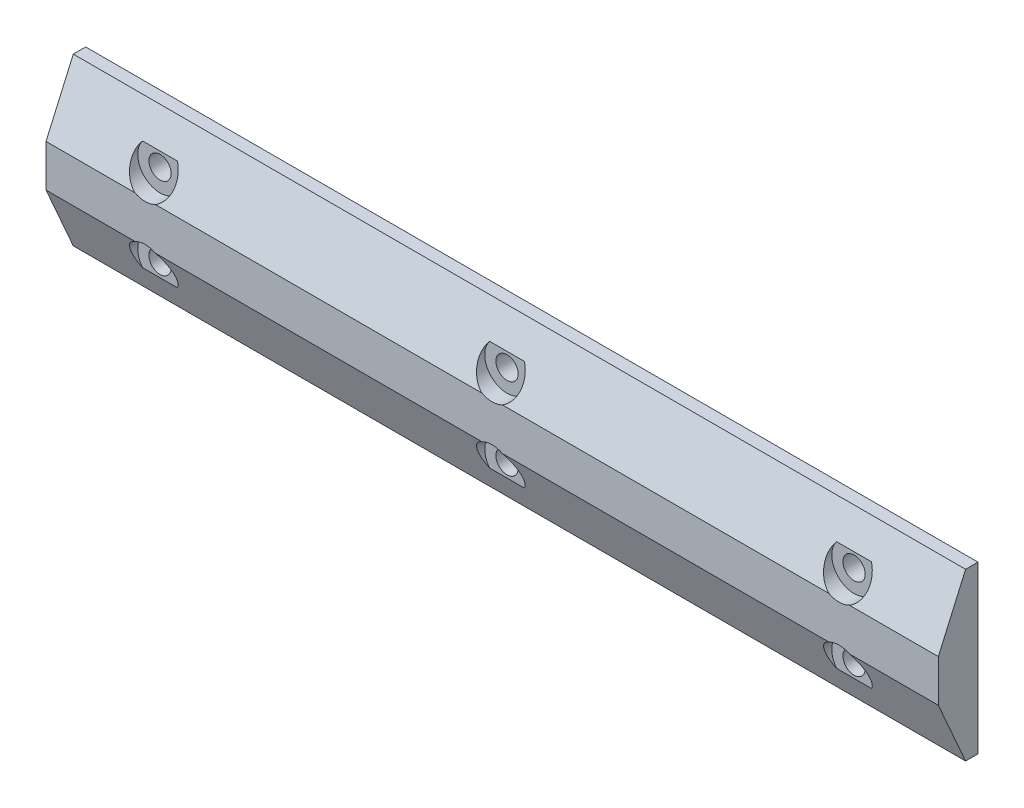
ISO-10303-21;
HEADER;
FILE_DESCRIPTION(('STEP AP214'),'2;1');
FILE_NAME('part.step','',(''),(''),'','','');
FILE_SCHEMA(('AUTOMOTIVE_DESIGN { 1 0 10303 214 1 1 1 1 }'));
ENDSEC;
DATA;
#1=APPLICATION_CONTEXT('core data for automotive mechanical design processes');
#2=APPLICATION_PROTOCOL_DEFINITION('international standard','automotive_design',2000,#1);
#3=PRODUCT_CONTEXT('',#1,'mechanical');
#4=PRODUCT('Part','Part','',(#3));
#5=PRODUCT_RELATED_PRODUCT_CATEGORY('part','',(#4));
#6=PRODUCT_DEFINITION_FORMATION('','',#4);
#7=PRODUCT_DEFINITION_CONTEXT('part definition',#1,'design');
#8=PRODUCT_DEFINITION('design','',#6,#7);
#9=PRODUCT_DEFINITION_SHAPE('','',#8);
#10=(LENGTH_UNIT() NAMED_UNIT(*) SI_UNIT(.MILLI.,.METRE.));
#11=(NAMED_UNIT(*) PLANE_ANGLE_UNIT() SI_UNIT($,.RADIAN.));
#12=(NAMED_UNIT(*) SI_UNIT($,.STERADIAN.) SOLID_ANGLE_UNIT());
#13=UNCERTAINTY_MEASURE_WITH_UNIT(LENGTH_MEASURE(1.E-05),#10,'distance_accuracy_value','');
#14=(GEOMETRIC_REPRESENTATION_CONTEXT(3) GLOBAL_UNCERTAINTY_ASSIGNED_CONTEXT((#13)) GLOBAL_UNIT_ASSIGNED_CONTEXT((#10,
#11,#12)) REPRESENTATION_CONTEXT('',''));
#15=CARTESIAN_POINT('',(0.,0.,0.));
#16=DIRECTION('',(0.,0.,1.));
#17=DIRECTION('',(1.,0.,0.));
#18=AXIS2_PLACEMENT_3D('',#15,#16,#17);
#19=CARTESIAN_POINT('',(0.,0.,16.));
#20=DIRECTION('',(1.,0.,0.));
#21=DIRECTION('',(0.,0.,-1.));
#22=AXIS2_PLACEMENT_3D('',#19,#20,#21);
#23=PLANE('',#22);
#24=DIRECTION('',(0.,0.,-1.));
#25=VECTOR('',#24,1.);
#26=CARTESIAN_POINT('',(0.,0.,16.));
#27=LINE('',#26,#25);
#28=CARTESIAN_POINT('',(0.,0.,5.));
#29=VERTEX_POINT('',#28);
#30=CARTESIAN_POINT('',(0.,0.,0.));
#31=VERTEX_POINT('',#30);
#32=EDGE_CURVE('E327',#29,#31,#27,.T.);
#33=ORIENTED_EDGE('',*,*,#32,.F.);
#34=DIRECTION('',(0.,-0.915315032422765,-0.402738614266017));
#35=VECTOR('',#34,1.);
#36=CARTESIAN_POINT('',(0.,0.,5.));
#37=LINE('',#36,#35);
#38=CARTESIAN_POINT('',(0.,25.,16.));
#39=VERTEX_POINT('',#38);
#40=EDGE_CURVE('E186',#39,#29,#37,.T.);
#41=ORIENTED_EDGE('',*,*,#40,.F.);
#42=DIRECTION('',(0.,-1.,0.));
#43=VECTOR('',#42,1.);
#44=CARTESIAN_POINT('',(0.,0.,16.));
#45=LINE('',#44,#43);
#46=CARTESIAN_POINT('',(0.,42.,16.));
#47=VERTEX_POINT('',#46);
#48=EDGE_CURVE('E309',#47,#39,#45,.T.);
#49=ORIENTED_EDGE('',*,*,#48,.F.);
#50=DIRECTION('',(0.,-0.915315032422765,0.402738614266017));
#51=VECTOR('',#50,1.);
#52=CARTESIAN_POINT('',(0.,67.,5.));
#53=LINE('',#52,#51);
#54=CARTESIAN_POINT('',(0.,67.,5.));
#55=VERTEX_POINT('',#54);
#56=EDGE_CURVE('E172',#55,#47,#53,.T.);
#57=ORIENTED_EDGE('',*,*,#56,.F.);
#58=DIRECTION('',(0.,0.,-1.));
#59=VECTOR('',#58,1.);
#60=CARTESIAN_POINT('',(0.,67.,16.));
#61=LINE('',#60,#59);
#62=CARTESIAN_POINT('',(0.,67.,0.));
#63=VERTEX_POINT('',#62);
#64=EDGE_CURVE('E308',#55,#63,#61,.T.);
#65=ORIENTED_EDGE('',*,*,#64,.T.);
#66=DIRECTION('',(0.,-1.,0.));
#67=VECTOR('',#66,1.);
#68=CARTESIAN_POINT('',(0.,0.,0.));
#69=LINE('',#68,#67);
#70=EDGE_CURVE('E292',#63,#31,#69,.T.);
#71=ORIENTED_EDGE('',*,*,#70,.T.);
#72=EDGE_LOOP('',(#33,#41,#49,#57,#65,#71));
#73=FACE_BOUND('',#72,.T.);
#74=ADVANCED_FACE('F34',(#73),#23,.F.);
#75=CARTESIAN_POINT('',(0.,0.,16.));
#76=DIRECTION('',(0.,1.,0.));
#77=DIRECTION('',(0.,0.,1.));
#78=AXIS2_PLACEMENT_3D('',#75,#76,#77);
#79=PLANE('',#78);
#80=DIRECTION('',(0.,0.,-1.));
#81=VECTOR('',#80,1.);
#82=CARTESIAN_POINT('',(360.,0.,16.));
#83=LINE('',#82,#81);
#84=CARTESIAN_POINT('',(360.,0.,5.));
#85=VERTEX_POINT('',#84);
#86=CARTESIAN_POINT('',(360.,0.,0.));
#87=VERTEX_POINT('',#86);
#88=EDGE_CURVE('E325',#85,#87,#83,.T.);
#89=ORIENTED_EDGE('',*,*,#88,.F.);
#90=DIRECTION('',(-1.,0.,0.));
#91=VECTOR('',#90,1.);
#92=CARTESIAN_POINT('',(360.,0.,5.));
#93=LINE('',#92,#91);
#94=EDGE_CURVE('E289',#85,#29,#93,.T.);
#95=ORIENTED_EDGE('',*,*,#94,.T.);
#96=ORIENTED_EDGE('',*,*,#32,.T.);
#97=DIRECTION('',(1.,0.,0.));
#98=VECTOR('',#97,1.);
#99=CARTESIAN_POINT('',(0.,0.,0.));
#100=LINE('',#99,#98);
#101=EDGE_CURVE('E317',#31,#87,#100,.T.);
#102=ORIENTED_EDGE('',*,*,#101,.T.);
#103=EDGE_LOOP('',(#89,#95,#96,#102));
#104=FACE_BOUND('',#103,.T.);
#105=ADVANCED_FACE('F358',(#104),#79,.F.);
#106=CARTESIAN_POINT('',(360.,0.,16.));
#107=DIRECTION('',(-1.,0.,0.));
#108=DIRECTION('',(0.,0.,1.));
#109=AXIS2_PLACEMENT_3D('',#106,#107,#108);
#110=PLANE('',#109);
#111=DIRECTION('',(0.,1.,0.));
#112=VECTOR('',#111,1.);
#113=CARTESIAN_POINT('',(360.,0.,16.));
#114=LINE('',#113,#112);
#115=CARTESIAN_POINT('',(360.,25.,16.));
#116=VERTEX_POINT('',#115);
#117=CARTESIAN_POINT('',(360.,42.,16.));
#118=VERTEX_POINT('',#117);
#119=EDGE_CURVE('E302',#116,#118,#114,.T.);
#120=ORIENTED_EDGE('',*,*,#119,.F.);
#121=DIRECTION('',(0.,-0.915315032422765,-0.402738614266017));
#122=VECTOR('',#121,1.);
#123=CARTESIAN_POINT('',(360.,0.,5.));
#124=LINE('',#123,#122);
#125=EDGE_CURVE('E189',#116,#85,#124,.T.);
#126=ORIENTED_EDGE('',*,*,#125,.T.);
#127=ORIENTED_EDGE('',*,*,#88,.T.);
#128=DIRECTION('',(0.,1.,0.));
#129=VECTOR('',#128,1.);
#130=CARTESIAN_POINT('',(360.,0.,0.));
#131=LINE('',#130,#129);
#132=CARTESIAN_POINT('',(360.,67.,0.));
#133=VERTEX_POINT('',#132);
#134=EDGE_CURVE('E320',#87,#133,#131,.T.);
#135=ORIENTED_EDGE('',*,*,#134,.T.);
#136=DIRECTION('',(0.,0.,-1.));
#137=VECTOR('',#136,1.);
#138=CARTESIAN_POINT('',(360.,67.,16.));
#139=LINE('',#138,#137);
#140=CARTESIAN_POINT('',(360.,67.,5.));
#141=VERTEX_POINT('',#140);
#142=EDGE_CURVE('E304',#141,#133,#139,.T.);
#143=ORIENTED_EDGE('',*,*,#142,.F.);
#144=DIRECTION('',(0.,-0.915315032422765,0.402738614266017));
#145=VECTOR('',#144,1.);
#146=CARTESIAN_POINT('',(360.,67.,5.));
#147=LINE('',#146,#145);
#148=EDGE_CURVE('E182',#141,#118,#147,.T.);
#149=ORIENTED_EDGE('',*,*,#148,.T.);
#150=EDGE_LOOP('',(#120,#126,#127,#135,#143,#149));
#151=FACE_BOUND('',#150,.T.);
#152=ADVANCED_FACE('F301',(#151),#110,.F.);
#153=CARTESIAN_POINT('',(0.,67.,16.));
#154=DIRECTION('',(0.,-1.,0.));
#155=DIRECTION('',(0.,0.,-1.));
#156=AXIS2_PLACEMENT_3D('',#153,#154,#155);
#157=PLANE('',#156);
#158=ORIENTED_EDGE('',*,*,#64,.F.);
#159=DIRECTION('',(-1.,0.,0.));
#160=VECTOR('',#159,1.);
#161=CARTESIAN_POINT('',(360.,67.,5.));
#162=LINE('',#161,#160);
#163=EDGE_CURVE('E177',#141,#55,#162,.T.);
#164=ORIENTED_EDGE('',*,*,#163,.F.);
#165=ORIENTED_EDGE('',*,*,#142,.T.);
#166=DIRECTION('',(-1.,0.,0.));
#167=VECTOR('',#166,1.);
#168=CARTESIAN_POINT('',(0.,67.,0.));
#169=LINE('',#168,#167);
#170=EDGE_CURVE('E312',#133,#63,#169,.T.);
#171=ORIENTED_EDGE('',*,*,#170,.T.);
#172=EDGE_LOOP('',(#158,#164,#165,#171));
#173=FACE_BOUND('',#172,.T.);
#174=ADVANCED_FACE('F388',(#173),#157,.F.);
#175=CARTESIAN_POINT('',(0.,0.,16.));
#176=DIRECTION('',(0.,0.,-1.));
#177=DIRECTION('',(-1.,0.,0.));
#178=AXIS2_PLACEMENT_3D('',#175,#176,#177);
#179=PLANE('',#178);
#180=DIRECTION('',(-1.,0.,0.));
#181=VECTOR('',#180,1.);
#182=CARTESIAN_POINT('',(360.,42.,16.));
#183=LINE('',#182,#181);
#184=CARTESIAN_POINT('',(175.876894374382,42.,16.));
#185=VERTEX_POINT('',#184);
#186=CARTESIAN_POINT('',(44.1231056256177,42.,16.));
#187=VERTEX_POINT('',#186);
#188=EDGE_CURVE('E176',#185,#187,#183,.T.);
#189=ORIENTED_EDGE('',*,*,#188,.T.);
#190=CARTESIAN_POINT('',(40.,50.,16.));
#191=DIRECTION('',(0.,0.,1.));
#192=DIRECTION('',(1.,0.,0.));
#193=AXIS2_PLACEMENT_3D('',#190,#191,#192);
#194=CIRCLE('',#193,9.);
#195=CARTESIAN_POINT('',(35.8768943743823,42.,16.));
#196=VERTEX_POINT('',#195);
#197=EDGE_CURVE('E165',#196,#187,#194,.T.);
#198=ORIENTED_EDGE('',*,*,#197,.F.);
#199=EDGE_CURVE('E170',#196,#47,#183,.T.);
#200=ORIENTED_EDGE('',*,*,#199,.T.);
#201=ORIENTED_EDGE('',*,*,#48,.T.);
#202=DIRECTION('',(-1.,0.,0.));
#203=VECTOR('',#202,1.);
#204=CARTESIAN_POINT('',(360.,25.,16.));
#205=LINE('',#204,#203);
#206=CARTESIAN_POINT('',(35.8768943743823,25.,16.));
#207=VERTEX_POINT('',#206);
#208=EDGE_CURVE('E233',#207,#39,#205,.T.);
#209=ORIENTED_EDGE('',*,*,#208,.F.);
#210=CARTESIAN_POINT('',(40.,17.,16.));
#211=DIRECTION('',(0.,0.,1.));
#212=DIRECTION('',(1.,0.,0.));
#213=AXIS2_PLACEMENT_3D('',#210,#211,#212);
#214=CIRCLE('',#213,9.);
#215=CARTESIAN_POINT('',(44.1231056256177,25.,16.));
#216=VERTEX_POINT('',#215);
#217=EDGE_CURVE('E231',#216,#207,#214,.T.);
#218=ORIENTED_EDGE('',*,*,#217,.F.);
#219=CARTESIAN_POINT('',(175.876894374382,25.,16.));
#220=VERTEX_POINT('',#219);
#221=EDGE_CURVE('E227',#220,#216,#205,.T.);
#222=ORIENTED_EDGE('',*,*,#221,.F.);
#223=CARTESIAN_POINT('',(180.,17.,16.));
#224=DIRECTION('',(0.,0.,1.));
#225=DIRECTION('',(1.,0.,0.));
#226=AXIS2_PLACEMENT_3D('',#223,#224,#225);
#227=CIRCLE('',#226,9.00000000000001);
#228=CARTESIAN_POINT('',(184.123105625618,25.,16.));
#229=VERTEX_POINT('',#228);
#230=EDGE_CURVE('E256',#229,#220,#227,.T.);
#231=ORIENTED_EDGE('',*,*,#230,.F.);
#232=CARTESIAN_POINT('',(315.876894374382,25.,16.));
#233=VERTEX_POINT('',#232);
#234=EDGE_CURVE('E296',#233,#229,#205,.T.);
#235=ORIENTED_EDGE('',*,*,#234,.F.);
#236=CARTESIAN_POINT('',(320.,17.,16.));
#237=DIRECTION('',(0.,0.,1.));
#238=DIRECTION('',(1.,0.,0.));
#239=AXIS2_PLACEMENT_3D('',#236,#237,#238);
#240=CIRCLE('',#239,9.00000000000001);
#241=CARTESIAN_POINT('',(324.123105625618,25.,16.));
#242=VERTEX_POINT('',#241);
#243=EDGE_CURVE('E276',#242,#233,#240,.T.);
#244=ORIENTED_EDGE('',*,*,#243,.F.);
#245=EDGE_CURVE('E293',#116,#242,#205,.T.);
#246=ORIENTED_EDGE('',*,*,#245,.F.);
#247=ORIENTED_EDGE('',*,*,#119,.T.);
#248=CARTESIAN_POINT('',(324.123105625618,42.,16.));
#249=VERTEX_POINT('',#248);
#250=EDGE_CURVE('E179',#118,#249,#183,.T.);
#251=ORIENTED_EDGE('',*,*,#250,.T.);
#252=CARTESIAN_POINT('',(320.,50.,16.));
#253=DIRECTION('',(0.,0.,1.));
#254=DIRECTION('',(1.,0.,0.));
#255=AXIS2_PLACEMENT_3D('',#252,#253,#254);
#256=CIRCLE('',#255,9.00000000000001);
#257=CARTESIAN_POINT('',(315.876894374382,42.,16.));
#258=VERTEX_POINT('',#257);
#259=EDGE_CURVE('E197',#258,#249,#256,.T.);
#260=ORIENTED_EDGE('',*,*,#259,.F.);
#261=CARTESIAN_POINT('',(184.123105625618,42.,16.));
#262=VERTEX_POINT('',#261);
#263=EDGE_CURVE('E181',#258,#262,#183,.T.);
#264=ORIENTED_EDGE('',*,*,#263,.T.);
#265=CARTESIAN_POINT('',(180.,50.,16.));
#266=DIRECTION('',(0.,0.,1.));
#267=DIRECTION('',(1.,0.,0.));
#268=AXIS2_PLACEMENT_3D('',#265,#266,#267);
#269=CIRCLE('',#268,9.00000000000001);
#270=EDGE_CURVE('E195',#185,#262,#269,.T.);
#271=ORIENTED_EDGE('',*,*,#270,.F.);
#272=EDGE_LOOP('',(#189,#198,#200,#201,#209,#218,#222,#231,#235,#244,#246,#247,#251,#260,#264,#271));
#273=FACE_BOUND('',#272,.T.);
#274=ADVANCED_FACE('F194',(#273),#179,.F.);
#275=CARTESIAN_POINT('',(0.,0.,0.));
#276=DIRECTION('',(0.,0.,-1.));
#277=DIRECTION('',(-1.,0.,0.));
#278=AXIS2_PLACEMENT_3D('',#275,#276,#277);
#279=PLANE('',#278);
#280=CARTESIAN_POINT('',(40.,50.,0.));
#281=DIRECTION('',(0.,0.,1.));
#282=DIRECTION('',(1.,0.,0.));
#283=AXIS2_PLACEMENT_3D('',#280,#281,#282);
#284=CIRCLE('',#283,4.5);
#285=CARTESIAN_POINT('',(44.5,50.,0.));
#286=VERTEX_POINT('',#285);
#287=EDGE_CURVE('E234',#286,#286,#284,.T.);
#288=ORIENTED_EDGE('',*,*,#287,.T.);
#289=EDGE_LOOP('',(#288));
#290=FACE_BOUND('',#289,.T.);
#291=CARTESIAN_POINT('',(40.,17.,0.));
#292=DIRECTION('',(0.,0.,1.));
#293=DIRECTION('',(1.,0.,0.));
#294=AXIS2_PLACEMENT_3D('',#291,#292,#293);
#295=CIRCLE('',#294,4.5);
#296=CARTESIAN_POINT('',(44.5,17.,0.));
#297=VERTEX_POINT('',#296);
#298=EDGE_CURVE('E244',#297,#297,#295,.T.);
#299=ORIENTED_EDGE('',*,*,#298,.T.);
#300=EDGE_LOOP('',(#299));
#301=FACE_BOUND('',#300,.T.);
#302=CARTESIAN_POINT('',(180.,50.,0.));
#303=DIRECTION('',(0.,0.,1.));
#304=DIRECTION('',(1.,0.,0.));
#305=AXIS2_PLACEMENT_3D('',#302,#303,#304);
#306=CIRCLE('',#305,4.5);
#307=CARTESIAN_POINT('',(184.5,50.,0.));
#308=VERTEX_POINT('',#307);
#309=EDGE_CURVE('E253',#308,#308,#306,.T.);
#310=ORIENTED_EDGE('',*,*,#309,.T.);
#311=EDGE_LOOP('',(#310));
#312=FACE_BOUND('',#311,.T.);
#313=CARTESIAN_POINT('',(180.,17.,0.));
#314=DIRECTION('',(0.,0.,1.));
#315=DIRECTION('',(1.,0.,0.));
#316=AXIS2_PLACEMENT_3D('',#313,#314,#315);
#317=CIRCLE('',#316,4.5);
#318=CARTESIAN_POINT('',(184.5,17.,0.));
#319=VERTEX_POINT('',#318);
#320=EDGE_CURVE('E263',#319,#319,#317,.T.);
#321=ORIENTED_EDGE('',*,*,#320,.T.);
#322=EDGE_LOOP('',(#321));
#323=FACE_BOUND('',#322,.T.);
#324=CARTESIAN_POINT('',(320.,50.,0.));
#325=DIRECTION('',(0.,0.,1.));
#326=DIRECTION('',(1.,0.,0.));
#327=AXIS2_PLACEMENT_3D('',#324,#325,#326);
#328=CIRCLE('',#327,4.5);
#329=CARTESIAN_POINT('',(324.5,50.,0.));
#330=VERTEX_POINT('',#329);
#331=EDGE_CURVE('E273',#330,#330,#328,.T.);
#332=ORIENTED_EDGE('',*,*,#331,.T.);
#333=EDGE_LOOP('',(#332));
#334=FACE_BOUND('',#333,.T.);
#335=CARTESIAN_POINT('',(320.,17.,0.));
#336=DIRECTION('',(0.,0.,1.));
#337=DIRECTION('',(1.,0.,0.));
#338=AXIS2_PLACEMENT_3D('',#335,#336,#337);
#339=CIRCLE('',#338,4.5);
#340=CARTESIAN_POINT('',(324.5,17.,0.));
#341=VERTEX_POINT('',#340);
#342=EDGE_CURVE('E284',#341,#341,#339,.T.);
#343=ORIENTED_EDGE('',*,*,#342,.T.);
#344=EDGE_LOOP('',(#343));
#345=FACE_BOUND('',#344,.T.);
#346=ORIENTED_EDGE('',*,*,#70,.F.);
#347=ORIENTED_EDGE('',*,*,#170,.F.);
#348=ORIENTED_EDGE('',*,*,#134,.F.);
#349=ORIENTED_EDGE('',*,*,#101,.F.);
#350=EDGE_LOOP('',(#346,#347,#348,#349));
#351=FACE_BOUND('',#350,.T.);
#352=ADVANCED_FACE('F361',(#290,#301,#312,#323,#334,#345,#351),#279,.T.);
#353=CARTESIAN_POINT('',(360.,67.,5.));
#354=DIRECTION('',(0.,-0.402738614266017,-0.915315032422766));
#355=DIRECTION('',(0.,0.915315032422766,-0.402738614266017));
#356=AXIS2_PLACEMENT_3D('',#353,#354,#355);
#357=PLANE('',#356);
#358=ORIENTED_EDGE('',*,*,#199,.F.);
#359=CARTESIAN_POINT('',(40.,50.,12.48));
#360=DIRECTION('',(0.,-0.402738614266017,-0.915315032422766));
#361=DIRECTION('',(0.,-0.915315032422766,0.402738614266017));
#362=AXIS2_PLACEMENT_3D('',#359,#360,#361);
#363=ELLIPSE('',#362,9.83268020429832,9.);
#364=CARTESIAN_POINT('',(32.9834905431064,55.6363636363636,10.));
#365=VERTEX_POINT('',#364);
#366=EDGE_CURVE('E11',#196,#365,#363,.T.);
#367=ORIENTED_EDGE('',*,*,#366,.T.);
#368=DIRECTION('',(1.,0.,0.));
#369=VECTOR('',#368,1.);
#370=CARTESIAN_POINT('',(360.,55.6363636363636,10.));
#371=LINE('',#370,#369);
#372=CARTESIAN_POINT('',(47.0165094568936,55.6363636363636,10.));
#373=VERTEX_POINT('',#372);
#374=EDGE_CURVE('E156',#365,#373,#371,.T.);
#375=ORIENTED_EDGE('',*,*,#374,.T.);
#376=EDGE_CURVE('E37',#373,#187,#363,.T.);
#377=ORIENTED_EDGE('',*,*,#376,.T.);
#378=ORIENTED_EDGE('',*,*,#188,.F.);
#379=CARTESIAN_POINT('',(180.,50.,12.48));
#380=DIRECTION('',(0.,-0.402738614266017,-0.915315032422766));
#381=DIRECTION('',(0.,-0.915315032422766,0.402738614266017));
#382=AXIS2_PLACEMENT_3D('',#379,#380,#381);
#383=ELLIPSE('',#382,9.83268020429833,9.00000000000001);
#384=CARTESIAN_POINT('',(172.983490543106,55.6363636363636,10.));
#385=VERTEX_POINT('',#384);
#386=EDGE_CURVE('E209',#185,#385,#383,.T.);
#387=ORIENTED_EDGE('',*,*,#386,.T.);
#388=DIRECTION('',(1.,0.,0.));
#389=VECTOR('',#388,1.);
#390=CARTESIAN_POINT('',(360.,55.6363636363636,10.));
#391=LINE('',#390,#389);
#392=CARTESIAN_POINT('',(187.016509456894,55.6363636363636,10.));
#393=VERTEX_POINT('',#392);
#394=EDGE_CURVE('E206',#385,#393,#391,.T.);
#395=ORIENTED_EDGE('',*,*,#394,.T.);
#396=EDGE_CURVE('E204',#393,#262,#383,.T.);
#397=ORIENTED_EDGE('',*,*,#396,.T.);
#398=ORIENTED_EDGE('',*,*,#263,.F.);
#399=CARTESIAN_POINT('',(320.,50.,12.48));
#400=DIRECTION('',(0.,-0.402738614266017,-0.915315032422766));
#401=DIRECTION('',(0.,-0.915315032422766,0.402738614266017));
#402=AXIS2_PLACEMENT_3D('',#399,#400,#401);
#403=ELLIPSE('',#402,9.83268020429833,9.00000000000001);
#404=CARTESIAN_POINT('',(312.983490543106,55.6363636363636,10.));
#405=VERTEX_POINT('',#404);
#406=EDGE_CURVE('E201',#258,#405,#403,.T.);
#407=ORIENTED_EDGE('',*,*,#406,.T.);
#408=DIRECTION('',(1.,0.,0.));
#409=VECTOR('',#408,1.);
#410=CARTESIAN_POINT('',(360.,55.6363636363636,10.));
#411=LINE('',#410,#409);
#412=CARTESIAN_POINT('',(327.016509456894,55.6363636363636,10.));
#413=VERTEX_POINT('',#412);
#414=EDGE_CURVE('E339',#405,#413,#411,.T.);
#415=ORIENTED_EDGE('',*,*,#414,.T.);
#416=EDGE_CURVE('E336',#413,#249,#403,.T.);
#417=ORIENTED_EDGE('',*,*,#416,.T.);
#418=ORIENTED_EDGE('',*,*,#250,.F.);
#419=ORIENTED_EDGE('',*,*,#148,.F.);
#420=ORIENTED_EDGE('',*,*,#163,.T.);
#421=ORIENTED_EDGE('',*,*,#56,.T.);
#422=EDGE_LOOP('',(#358,#367,#375,#377,#378,#387,#395,#397,#398,#407,#415,#417,#418,#419,#420,#421));
#423=FACE_BOUND('',#422,.T.);
#424=ADVANCED_FACE('F168',(#423),#357,.F.);
#425=CARTESIAN_POINT('',(360.,0.,5.));
#426=DIRECTION('',(0.,0.402738614266017,-0.915315032422766));
#427=DIRECTION('',(0.,0.915315032422766,0.402738614266017));
#428=AXIS2_PLACEMENT_3D('',#425,#426,#427);
#429=PLANE('',#428);
#430=ORIENTED_EDGE('',*,*,#221,.T.);
#431=CARTESIAN_POINT('',(40.,17.,12.48));
#432=DIRECTION('',(0.,0.402738614266017,-0.915315032422766));
#433=DIRECTION('',(0.,0.915315032422766,0.402738614266017));
#434=AXIS2_PLACEMENT_3D('',#431,#432,#433);
#435=ELLIPSE('',#434,9.83268020429832,9.);
#436=CARTESIAN_POINT('',(47.0165094568936,11.3636363636364,10.));
#437=VERTEX_POINT('',#436);
#438=EDGE_CURVE('E160',#216,#437,#435,.T.);
#439=ORIENTED_EDGE('',*,*,#438,.T.);
#440=DIRECTION('',(-1.,0.,0.));
#441=VECTOR('',#440,1.);
#442=CARTESIAN_POINT('',(360.,11.3636363636364,10.));
#443=LINE('',#442,#441);
#444=CARTESIAN_POINT('',(32.9834905431064,11.3636363636364,10.));
#445=VERTEX_POINT('',#444);
#446=EDGE_CURVE('E211',#437,#445,#443,.T.);
#447=ORIENTED_EDGE('',*,*,#446,.T.);
#448=EDGE_CURVE('E218',#445,#207,#435,.T.);
#449=ORIENTED_EDGE('',*,*,#448,.T.);
#450=ORIENTED_EDGE('',*,*,#208,.T.);
#451=ORIENTED_EDGE('',*,*,#40,.T.);
#452=ORIENTED_EDGE('',*,*,#94,.F.);
#453=ORIENTED_EDGE('',*,*,#125,.F.);
#454=ORIENTED_EDGE('',*,*,#245,.T.);
#455=CARTESIAN_POINT('',(320.,17.,12.48));
#456=DIRECTION('',(0.,0.402738614266017,-0.915315032422766));
#457=DIRECTION('',(0.,0.915315032422766,0.402738614266017));
#458=AXIS2_PLACEMENT_3D('',#455,#456,#457);
#459=ELLIPSE('',#458,9.83268020429833,9.00000000000001);
#460=CARTESIAN_POINT('',(327.016509456894,11.3636363636364,10.));
#461=VERTEX_POINT('',#460);
#462=EDGE_CURVE('E333',#242,#461,#459,.T.);
#463=ORIENTED_EDGE('',*,*,#462,.T.);
#464=DIRECTION('',(-1.,0.,0.));
#465=VECTOR('',#464,1.);
#466=CARTESIAN_POINT('',(360.,11.3636363636364,10.));
#467=LINE('',#466,#465);
#468=CARTESIAN_POINT('',(312.983490543106,11.3636363636364,10.));
#469=VERTEX_POINT('',#468);
#470=EDGE_CURVE('E332',#461,#469,#467,.T.);
#471=ORIENTED_EDGE('',*,*,#470,.T.);
#472=EDGE_CURVE('E329',#469,#233,#459,.T.);
#473=ORIENTED_EDGE('',*,*,#472,.T.);
#474=ORIENTED_EDGE('',*,*,#234,.T.);
#475=CARTESIAN_POINT('',(180.,17.,12.48));
#476=DIRECTION('',(0.,0.402738614266017,-0.915315032422766));
#477=DIRECTION('',(0.,0.915315032422766,0.402738614266017));
#478=AXIS2_PLACEMENT_3D('',#475,#476,#477);
#479=ELLIPSE('',#478,9.83268020429833,9.00000000000001);
#480=CARTESIAN_POINT('',(187.016509456894,11.3636363636364,10.));
#481=VERTEX_POINT('',#480);
#482=EDGE_CURVE('E212',#229,#481,#479,.T.);
#483=ORIENTED_EDGE('',*,*,#482,.T.);
#484=DIRECTION('',(-1.,0.,0.));
#485=VECTOR('',#484,1.);
#486=CARTESIAN_POINT('',(360.,11.3636363636364,10.));
#487=LINE('',#486,#485);
#488=CARTESIAN_POINT('',(172.983490543106,11.3636363636364,10.));
#489=VERTEX_POINT('',#488);
#490=EDGE_CURVE('E341',#481,#489,#487,.T.);
#491=ORIENTED_EDGE('',*,*,#490,.T.);
#492=EDGE_CURVE('E343',#489,#220,#479,.T.);
#493=ORIENTED_EDGE('',*,*,#492,.T.);
#494=EDGE_LOOP('',(#430,#439,#447,#449,#450,#451,#452,#453,#454,#463,#471,#473,#474,#483,#491,#493));
#495=FACE_BOUND('',#494,.T.);
#496=ADVANCED_FACE('F224',(#495),#429,.F.);
#497=CARTESIAN_POINT('',(324.5,17.,10.));
#498=DIRECTION('',(0.,0.,-1.));
#499=DIRECTION('',(-1.,0.,0.));
#500=AXIS2_PLACEMENT_3D('',#497,#498,#499);
#501=PLANE('',#500);
#502=CARTESIAN_POINT('',(320.,17.,10.));
#503=DIRECTION('',(0.,0.,1.));
#504=DIRECTION('',(1.,0.,0.));
#505=AXIS2_PLACEMENT_3D('',#502,#503,#504);
#506=CIRCLE('',#505,4.5);
#507=CARTESIAN_POINT('',(324.5,17.,10.));
#508=VERTEX_POINT('',#507);
#509=EDGE_CURVE('E281',#508,#508,#506,.T.);
#510=ORIENTED_EDGE('',*,*,#509,.F.);
#511=EDGE_LOOP('',(#510));
#512=FACE_BOUND('',#511,.T.);
#513=CARTESIAN_POINT('',(320.,17.,10.));
#514=DIRECTION('',(0.,0.,1.));
#515=DIRECTION('',(1.,0.,0.));
#516=AXIS2_PLACEMENT_3D('',#513,#514,#515);
#517=CIRCLE('',#516,9.00000000000001);
#518=EDGE_CURVE('E278',#461,#469,#517,.T.);
#519=ORIENTED_EDGE('',*,*,#518,.T.);
#520=ORIENTED_EDGE('',*,*,#470,.F.);
#521=EDGE_LOOP('',(#519,#520));
#522=FACE_BOUND('',#521,.T.);
#523=ADVANCED_FACE('F368',(#512,#522),#501,.F.);
#524=CARTESIAN_POINT('',(320.,17.,16.));
#525=DIRECTION('',(0.,0.,1.));
#526=DIRECTION('',(1.,0.,0.));
#527=AXIS2_PLACEMENT_3D('',#524,#525,#526);
#528=CYLINDRICAL_SURFACE('',#527,9.00000000000001);
#529=ORIENTED_EDGE('',*,*,#243,.T.);
#530=ORIENTED_EDGE('',*,*,#472,.F.);
#531=ORIENTED_EDGE('',*,*,#518,.F.);
#532=ORIENTED_EDGE('',*,*,#462,.F.);
#533=EDGE_LOOP('',(#529,#530,#531,#532));
#534=FACE_BOUND('',#533,.T.);
#535=ADVANCED_FACE('F366',(#534),#528,.F.);
#536=CARTESIAN_POINT('',(320.,17.,16.));
#537=DIRECTION('',(0.,0.,1.));
#538=DIRECTION('',(1.,0.,0.));
#539=AXIS2_PLACEMENT_3D('',#536,#537,#538);
#540=CYLINDRICAL_SURFACE('',#539,4.5);
#541=ORIENTED_EDGE('',*,*,#342,.F.);
#542=EDGE_LOOP('',(#541));
#543=FACE_BOUND('',#542,.T.);
#544=ORIENTED_EDGE('',*,*,#509,.T.);
#545=EDGE_LOOP('',(#544));
#546=FACE_BOUND('',#545,.T.);
#547=ADVANCED_FACE('F376',(#543,#546),#540,.F.);
#548=CARTESIAN_POINT('',(324.5,50.,10.));
#549=DIRECTION('',(0.,0.,-1.));
#550=DIRECTION('',(-1.,0.,0.));
#551=AXIS2_PLACEMENT_3D('',#548,#549,#550);
#552=PLANE('',#551);
#553=CARTESIAN_POINT('',(320.,50.,10.));
#554=DIRECTION('',(0.,0.,1.));
#555=DIRECTION('',(1.,0.,0.));
#556=AXIS2_PLACEMENT_3D('',#553,#554,#555);
#557=CIRCLE('',#556,4.5);
#558=CARTESIAN_POINT('',(324.5,50.,10.));
#559=VERTEX_POINT('',#558);
#560=EDGE_CURVE('E270',#559,#559,#557,.T.);
#561=ORIENTED_EDGE('',*,*,#560,.F.);
#562=EDGE_LOOP('',(#561));
#563=FACE_BOUND('',#562,.T.);
#564=CARTESIAN_POINT('',(320.,50.,10.));
#565=DIRECTION('',(0.,0.,1.));
#566=DIRECTION('',(1.,0.,0.));
#567=AXIS2_PLACEMENT_3D('',#564,#565,#566);
#568=CIRCLE('',#567,9.00000000000001);
#569=EDGE_CURVE('E267',#405,#413,#568,.T.);
#570=ORIENTED_EDGE('',*,*,#569,.T.);
#571=ORIENTED_EDGE('',*,*,#414,.F.);
#572=EDGE_LOOP('',(#570,#571));
#573=FACE_BOUND('',#572,.T.);
#574=ADVANCED_FACE('F401',(#563,#573),#552,.F.);
#575=CARTESIAN_POINT('',(320.,50.,16.));
#576=DIRECTION('',(0.,0.,1.));
#577=DIRECTION('',(1.,0.,0.));
#578=AXIS2_PLACEMENT_3D('',#575,#576,#577);
#579=CYLINDRICAL_SURFACE('',#578,9.00000000000001);
#580=ORIENTED_EDGE('',*,*,#259,.T.);
#581=ORIENTED_EDGE('',*,*,#416,.F.);
#582=ORIENTED_EDGE('',*,*,#569,.F.);
#583=ORIENTED_EDGE('',*,*,#406,.F.);
#584=EDGE_LOOP('',(#580,#581,#582,#583));
#585=FACE_BOUND('',#584,.T.);
#586=ADVANCED_FACE('F406',(#585),#579,.F.);
#587=CARTESIAN_POINT('',(320.,50.,16.));
#588=DIRECTION('',(0.,0.,1.));
#589=DIRECTION('',(1.,0.,0.));
#590=AXIS2_PLACEMENT_3D('',#587,#588,#589);
#591=CYLINDRICAL_SURFACE('',#590,4.5);
#592=ORIENTED_EDGE('',*,*,#331,.F.);
#593=EDGE_LOOP('',(#592));
#594=FACE_BOUND('',#593,.T.);
#595=ORIENTED_EDGE('',*,*,#560,.T.);
#596=EDGE_LOOP('',(#595));
#597=FACE_BOUND('',#596,.T.);
#598=ADVANCED_FACE('F415',(#594,#597),#591,.F.);
#599=CARTESIAN_POINT('',(180.,17.,16.));
#600=DIRECTION('',(0.,0.,1.));
#601=DIRECTION('',(1.,0.,0.));
#602=AXIS2_PLACEMENT_3D('',#599,#600,#601);
#603=CYLINDRICAL_SURFACE('',#602,9.00000000000001);
#604=ORIENTED_EDGE('',*,*,#230,.T.);
#605=ORIENTED_EDGE('',*,*,#492,.F.);
#606=CARTESIAN_POINT('',(180.,17.,10.));
#607=DIRECTION('',(0.,0.,1.));
#608=DIRECTION('',(1.,0.,0.));
#609=AXIS2_PLACEMENT_3D('',#606,#607,#608);
#610=CIRCLE('',#609,9.00000000000001);
#611=EDGE_CURVE('E258',#481,#489,#610,.T.);
#612=ORIENTED_EDGE('',*,*,#611,.F.);
#613=ORIENTED_EDGE('',*,*,#482,.F.);
#614=EDGE_LOOP('',(#604,#605,#612,#613));
#615=FACE_BOUND('',#614,.T.);
#616=ADVANCED_FACE('F350',(#615),#603,.F.);
#617=CARTESIAN_POINT('',(184.5,17.,10.));
#618=DIRECTION('',(0.,0.,-1.));
#619=DIRECTION('',(-1.,0.,0.));
#620=AXIS2_PLACEMENT_3D('',#617,#618,#619);
#621=PLANE('',#620);
#622=CARTESIAN_POINT('',(180.,17.,10.));
#623=DIRECTION('',(0.,0.,1.));
#624=DIRECTION('',(1.,0.,0.));
#625=AXIS2_PLACEMENT_3D('',#622,#623,#624);
#626=CIRCLE('',#625,4.5);
#627=CARTESIAN_POINT('',(184.5,17.,10.));
#628=VERTEX_POINT('',#627);
#629=EDGE_CURVE('E260',#628,#628,#626,.T.);
#630=ORIENTED_EDGE('',*,*,#629,.F.);
#631=EDGE_LOOP('',(#630));
#632=FACE_BOUND('',#631,.T.);
#633=ORIENTED_EDGE('',*,*,#611,.T.);
#634=ORIENTED_EDGE('',*,*,#490,.F.);
#635=EDGE_LOOP('',(#633,#634));
#636=FACE_BOUND('',#635,.T.);
#637=ADVANCED_FACE('F427',(#632,#636),#621,.F.);
#638=CARTESIAN_POINT('',(180.,17.,16.));
#639=DIRECTION('',(0.,0.,1.));
#640=DIRECTION('',(1.,0.,0.));
#641=AXIS2_PLACEMENT_3D('',#638,#639,#640);
#642=CYLINDRICAL_SURFACE('',#641,4.5);
#643=ORIENTED_EDGE('',*,*,#320,.F.);
#644=EDGE_LOOP('',(#643));
#645=FACE_BOUND('',#644,.T.);
#646=ORIENTED_EDGE('',*,*,#629,.T.);
#647=EDGE_LOOP('',(#646));
#648=FACE_BOUND('',#647,.T.);
#649=ADVANCED_FACE('F435',(#645,#648),#642,.F.);
#650=CARTESIAN_POINT('',(180.,50.,16.));
#651=DIRECTION('',(0.,0.,1.));
#652=DIRECTION('',(1.,0.,0.));
#653=AXIS2_PLACEMENT_3D('',#650,#651,#652);
#654=CYLINDRICAL_SURFACE('',#653,9.00000000000001);
#655=ORIENTED_EDGE('',*,*,#270,.T.);
#656=ORIENTED_EDGE('',*,*,#396,.F.);
#657=CARTESIAN_POINT('',(180.,50.,10.));
#658=DIRECTION('',(0.,0.,1.));
#659=DIRECTION('',(1.,0.,0.));
#660=AXIS2_PLACEMENT_3D('',#657,#658,#659);
#661=CIRCLE('',#660,9.00000000000001);
#662=EDGE_CURVE('E248',#385,#393,#661,.T.);
#663=ORIENTED_EDGE('',*,*,#662,.F.);
#664=ORIENTED_EDGE('',*,*,#386,.F.);
#665=EDGE_LOOP('',(#655,#656,#663,#664));
#666=FACE_BOUND('',#665,.T.);
#667=ADVANCED_FACE('F442',(#666),#654,.F.);
#668=CARTESIAN_POINT('',(184.5,50.,10.));
#669=DIRECTION('',(0.,0.,-1.));
#670=DIRECTION('',(-1.,0.,0.));
#671=AXIS2_PLACEMENT_3D('',#668,#669,#670);
#672=PLANE('',#671);
#673=CARTESIAN_POINT('',(180.,50.,10.));
#674=DIRECTION('',(0.,0.,1.));
#675=DIRECTION('',(1.,0.,0.));
#676=AXIS2_PLACEMENT_3D('',#673,#674,#675);
#677=CIRCLE('',#676,4.5);
#678=CARTESIAN_POINT('',(184.5,50.,10.));
#679=VERTEX_POINT('',#678);
#680=EDGE_CURVE('E250',#679,#679,#677,.T.);
#681=ORIENTED_EDGE('',*,*,#680,.F.);
#682=EDGE_LOOP('',(#681));
#683=FACE_BOUND('',#682,.T.);
#684=ORIENTED_EDGE('',*,*,#662,.T.);
#685=ORIENTED_EDGE('',*,*,#394,.F.);
#686=EDGE_LOOP('',(#684,#685));
#687=FACE_BOUND('',#686,.T.);
#688=ADVANCED_FACE('F447',(#683,#687),#672,.F.);
#689=CARTESIAN_POINT('',(180.,50.,16.));
#690=DIRECTION('',(0.,0.,1.));
#691=DIRECTION('',(1.,0.,0.));
#692=AXIS2_PLACEMENT_3D('',#689,#690,#691);
#693=CYLINDRICAL_SURFACE('',#692,4.5);
#694=ORIENTED_EDGE('',*,*,#309,.F.);
#695=EDGE_LOOP('',(#694));
#696=FACE_BOUND('',#695,.T.);
#697=ORIENTED_EDGE('',*,*,#680,.T.);
#698=EDGE_LOOP('',(#697));
#699=FACE_BOUND('',#698,.T.);
#700=ADVANCED_FACE('F439',(#696,#699),#693,.F.);
#701=CARTESIAN_POINT('',(40.,17.,16.));
#702=DIRECTION('',(0.,0.,1.));
#703=DIRECTION('',(1.,0.,0.));
#704=AXIS2_PLACEMENT_3D('',#701,#702,#703);
#705=CYLINDRICAL_SURFACE('',#704,9.);
#706=ORIENTED_EDGE('',*,*,#217,.T.);
#707=ORIENTED_EDGE('',*,*,#448,.F.);
#708=CARTESIAN_POINT('',(40.,17.,10.));
#709=DIRECTION('',(0.,0.,1.));
#710=DIRECTION('',(1.,0.,0.));
#711=AXIS2_PLACEMENT_3D('',#708,#709,#710);
#712=CIRCLE('',#711,9.);
#713=EDGE_CURVE('E54',#437,#445,#712,.T.);
#714=ORIENTED_EDGE('',*,*,#713,.F.);
#715=ORIENTED_EDGE('',*,*,#438,.F.);
#716=EDGE_LOOP('',(#706,#707,#714,#715));
#717=FACE_BOUND('',#716,.T.);
#718=ADVANCED_FACE('F230',(#717),#705,.F.);
#719=CARTESIAN_POINT('',(44.5,17.,10.));
#720=DIRECTION('',(0.,0.,-1.));
#721=DIRECTION('',(-1.,0.,0.));
#722=AXIS2_PLACEMENT_3D('',#719,#720,#721);
#723=PLANE('',#722);
#724=CARTESIAN_POINT('',(40.,17.,10.));
#725=DIRECTION('',(0.,0.,1.));
#726=DIRECTION('',(1.,0.,0.));
#727=AXIS2_PLACEMENT_3D('',#724,#725,#726);
#728=CIRCLE('',#727,4.5);
#729=CARTESIAN_POINT('',(44.5,17.,10.));
#730=VERTEX_POINT('',#729);
#731=EDGE_CURVE('E236',#730,#730,#728,.T.);
#732=ORIENTED_EDGE('',*,*,#731,.F.);
#733=EDGE_LOOP('',(#732));
#734=FACE_BOUND('',#733,.T.);
#735=ORIENTED_EDGE('',*,*,#713,.T.);
#736=ORIENTED_EDGE('',*,*,#446,.F.);
#737=EDGE_LOOP('',(#735,#736));
#738=FACE_BOUND('',#737,.T.);
#739=ADVANCED_FACE('F462',(#734,#738),#723,.F.);
#740=CARTESIAN_POINT('',(40.,17.,16.));
#741=DIRECTION('',(0.,0.,1.));
#742=DIRECTION('',(1.,0.,0.));
#743=AXIS2_PLACEMENT_3D('',#740,#741,#742);
#744=CYLINDRICAL_SURFACE('',#743,4.5);
#745=ORIENTED_EDGE('',*,*,#298,.F.);
#746=EDGE_LOOP('',(#745));
#747=FACE_BOUND('',#746,.T.);
#748=ORIENTED_EDGE('',*,*,#731,.T.);
#749=EDGE_LOOP('',(#748));
#750=FACE_BOUND('',#749,.T.);
#751=ADVANCED_FACE('F459',(#747,#750),#744,.F.);
#752=CARTESIAN_POINT('',(40.,50.,16.));
#753=DIRECTION('',(0.,0.,1.));
#754=DIRECTION('',(1.,0.,0.));
#755=AXIS2_PLACEMENT_3D('',#752,#753,#754);
#756=CYLINDRICAL_SURFACE('',#755,9.);
#757=ORIENTED_EDGE('',*,*,#197,.T.);
#758=ORIENTED_EDGE('',*,*,#376,.F.);
#759=CARTESIAN_POINT('',(40.,50.,10.));
#760=DIRECTION('',(0.,0.,1.));
#761=DIRECTION('',(1.,0.,0.));
#762=AXIS2_PLACEMENT_3D('',#759,#760,#761);
#763=CIRCLE('',#762,9.);
#764=EDGE_CURVE('E47',#365,#373,#763,.T.);
#765=ORIENTED_EDGE('',*,*,#764,.F.);
#766=ORIENTED_EDGE('',*,*,#366,.F.);
#767=EDGE_LOOP('',(#757,#758,#765,#766));
#768=FACE_BOUND('',#767,.T.);
#769=ADVANCED_FACE('F162',(#768),#756,.F.);
#770=CARTESIAN_POINT('',(44.5,50.,10.));
#771=DIRECTION('',(0.,0.,-1.));
#772=DIRECTION('',(-1.,0.,0.));
#773=AXIS2_PLACEMENT_3D('',#770,#771,#772);
#774=PLANE('',#773);
#775=CARTESIAN_POINT('',(40.,50.,10.));
#776=DIRECTION('',(0.,0.,1.));
#777=DIRECTION('',(1.,0.,0.));
#778=AXIS2_PLACEMENT_3D('',#775,#776,#777);
#779=CIRCLE('',#778,4.5);
#780=CARTESIAN_POINT('',(44.5,50.,10.));
#781=VERTEX_POINT('',#780);
#782=EDGE_CURVE('E164',#781,#781,#779,.T.);
#783=ORIENTED_EDGE('',*,*,#782,.F.);
#784=EDGE_LOOP('',(#783));
#785=FACE_BOUND('',#784,.T.);
#786=ORIENTED_EDGE('',*,*,#764,.T.);
#787=ORIENTED_EDGE('',*,*,#374,.F.);
#788=EDGE_LOOP('',(#786,#787));
#789=FACE_BOUND('',#788,.T.);
#790=ADVANCED_FACE('F157',(#785,#789),#774,.F.);
#791=CARTESIAN_POINT('',(40.,50.,16.));
#792=DIRECTION('',(0.,0.,1.));
#793=DIRECTION('',(1.,0.,0.));
#794=AXIS2_PLACEMENT_3D('',#791,#792,#793);
#795=CYLINDRICAL_SURFACE('',#794,4.5);
#796=ORIENTED_EDGE('',*,*,#287,.F.);
#797=EDGE_LOOP('',(#796));
#798=FACE_BOUND('',#797,.T.);
#799=ORIENTED_EDGE('',*,*,#782,.T.);
#800=EDGE_LOOP('',(#799));
#801=FACE_BOUND('',#800,.T.);
#802=ADVANCED_FACE('F469',(#798,#801),#795,.F.);
#803=CLOSED_SHELL('',(#74,#105,#152,#174,#274,#352,#424,#496,#523,#535,#547,#574,#586,#598,#616,
#637,#649,#667,#688,#700,#718,#739,#751,#769,#790,#802));
#804=MANIFOLD_SOLID_BREP('B2',#803);
#805=ADVANCED_BREP_SHAPE_REPRESENTATION('',(#18,#804),#14);
#806=SHAPE_DEFINITION_REPRESENTATION(#9,#805);
ENDSEC;
END-ISO-10303-21;
